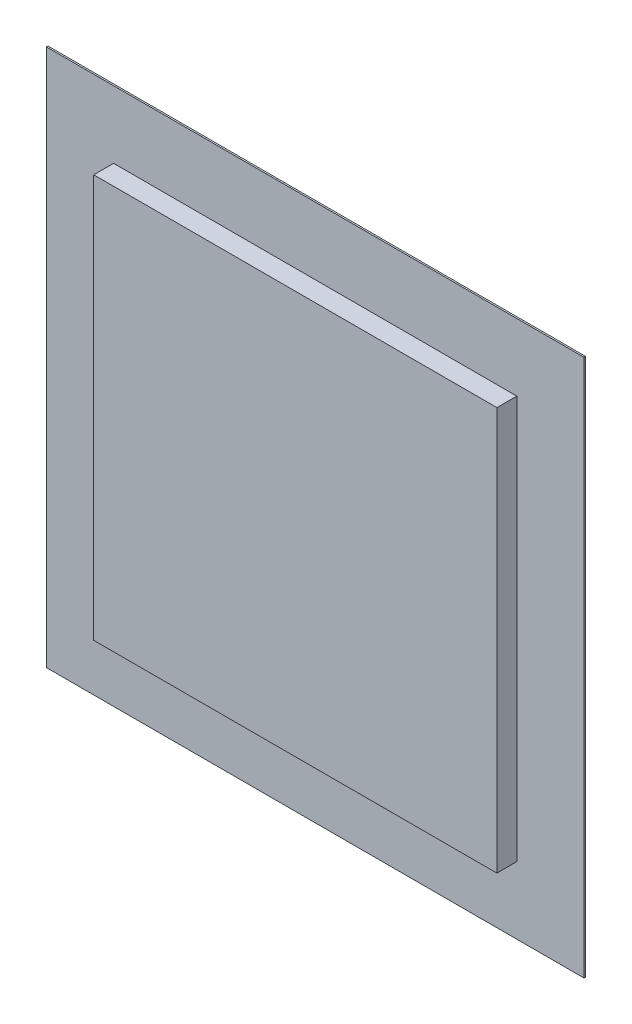
ISO-10303-21;
HEADER;
FILE_DESCRIPTION(('STEP AP214'),'2;1');
FILE_NAME('part.step','',(''),(''),'','','');
FILE_SCHEMA(('AUTOMOTIVE_DESIGN { 1 0 10303 214 1 1 1 1 }'));
ENDSEC;
DATA;
#1=APPLICATION_CONTEXT('core data for automotive mechanical design processes');
#2=APPLICATION_PROTOCOL_DEFINITION('international standard','automotive_design',2000,#1);
#3=PRODUCT_CONTEXT('',#1,'mechanical');
#4=PRODUCT('Part','Part','',(#3));
#5=PRODUCT_RELATED_PRODUCT_CATEGORY('part','',(#4));
#6=PRODUCT_DEFINITION_FORMATION('','',#4);
#7=PRODUCT_DEFINITION_CONTEXT('part definition',#1,'design');
#8=PRODUCT_DEFINITION('design','',#6,#7);
#9=PRODUCT_DEFINITION_SHAPE('','',#8);
#10=(LENGTH_UNIT() NAMED_UNIT(*) SI_UNIT(.MILLI.,.METRE.));
#11=(NAMED_UNIT(*) PLANE_ANGLE_UNIT() SI_UNIT($,.RADIAN.));
#12=(NAMED_UNIT(*) SI_UNIT($,.STERADIAN.) SOLID_ANGLE_UNIT());
#13=UNCERTAINTY_MEASURE_WITH_UNIT(LENGTH_MEASURE(1.E-05),#10,'distance_accuracy_value','');
#14=(GEOMETRIC_REPRESENTATION_CONTEXT(3) GLOBAL_UNCERTAINTY_ASSIGNED_CONTEXT((#13)) GLOBAL_UNIT_ASSIGNED_CONTEXT((#10,
#11,#12)) REPRESENTATION_CONTEXT('',''));
#15=CARTESIAN_POINT('',(0.,0.,0.));
#16=DIRECTION('',(0.,0.,1.));
#17=DIRECTION('',(1.,0.,0.));
#18=AXIS2_PLACEMENT_3D('',#15,#16,#17);
#19=CARTESIAN_POINT('',(0.,0.,0.3));
#20=DIRECTION('',(0.,0.,1.));
#21=DIRECTION('',(1.,0.,0.));
#22=AXIS2_PLACEMENT_3D('',#19,#20,#21);
#23=PLANE('',#22);
#24=DIRECTION('',(0.,-1.,0.));
#25=VECTOR('',#24,1.);
#26=CARTESIAN_POINT('',(-50.,50.,0.3));
#27=LINE('',#26,#25);
#28=CARTESIAN_POINT('',(-50.,50.,0.3));
#29=VERTEX_POINT('',#28);
#30=CARTESIAN_POINT('',(-50.,-50.,0.3));
#31=VERTEX_POINT('',#30);
#32=EDGE_CURVE('E147',#29,#31,#27,.T.);
#33=ORIENTED_EDGE('',*,*,#32,.T.);
#34=DIRECTION('',(1.,0.,0.));
#35=VECTOR('',#34,1.);
#36=CARTESIAN_POINT('',(-50.,-50.,0.3));
#37=LINE('',#36,#35);
#38=CARTESIAN_POINT('',(50.,-50.,0.3));
#39=VERTEX_POINT('',#38);
#40=EDGE_CURVE('E87',#31,#39,#37,.T.);
#41=ORIENTED_EDGE('',*,*,#40,.T.);
#42=DIRECTION('',(0.,1.,0.));
#43=VECTOR('',#42,1.);
#44=CARTESIAN_POINT('',(50.,-50.,0.3));
#45=LINE('',#44,#43);
#46=CARTESIAN_POINT('',(50.,50.,0.3));
#47=VERTEX_POINT('',#46);
#48=EDGE_CURVE('E150',#39,#47,#45,.T.);
#49=ORIENTED_EDGE('',*,*,#48,.T.);
#50=DIRECTION('',(-1.,0.,0.));
#51=VECTOR('',#50,1.);
#52=CARTESIAN_POINT('',(50.,50.,0.3));
#53=LINE('',#52,#51);
#54=EDGE_CURVE('E59',#47,#29,#53,.T.);
#55=ORIENTED_EDGE('',*,*,#54,.T.);
#56=EDGE_LOOP('',(#33,#41,#49,#55));
#57=FACE_BOUND('',#56,.T.);
#58=DIRECTION('',(-1.,0.,0.));
#59=VECTOR('',#58,1.);
#60=CARTESIAN_POINT('',(0.,-37.5,0.3));
#61=LINE('',#60,#59);
#62=CARTESIAN_POINT('',(37.5,-37.5,0.3));
#63=VERTEX_POINT('',#62);
#64=CARTESIAN_POINT('',(-37.5,-37.5,0.3));
#65=VERTEX_POINT('',#64);
#66=EDGE_CURVE('E143',#63,#65,#61,.T.);
#67=ORIENTED_EDGE('',*,*,#66,.T.);
#68=DIRECTION('',(0.,1.,0.));
#69=VECTOR('',#68,1.);
#70=CARTESIAN_POINT('',(-37.5,0.,0.3));
#71=LINE('',#70,#69);
#72=CARTESIAN_POINT('',(-37.5,37.5,0.3));
#73=VERTEX_POINT('',#72);
#74=EDGE_CURVE('E132',#65,#73,#71,.T.);
#75=ORIENTED_EDGE('',*,*,#74,.T.);
#76=DIRECTION('',(1.,0.,0.));
#77=VECTOR('',#76,1.);
#78=CARTESIAN_POINT('',(0.,37.5,0.3));
#79=LINE('',#78,#77);
#80=CARTESIAN_POINT('',(37.5,37.5,0.3));
#81=VERTEX_POINT('',#80);
#82=EDGE_CURVE('E133',#73,#81,#79,.T.);
#83=ORIENTED_EDGE('',*,*,#82,.T.);
#84=DIRECTION('',(0.,-1.,0.));
#85=VECTOR('',#84,1.);
#86=CARTESIAN_POINT('',(37.5,0.,0.3));
#87=LINE('',#86,#85);
#88=EDGE_CURVE('E136',#81,#63,#87,.T.);
#89=ORIENTED_EDGE('',*,*,#88,.T.);
#90=EDGE_LOOP('',(#67,#75,#83,#89));
#91=FACE_BOUND('',#90,.T.);
#92=ADVANCED_FACE('F35',(#57,#91),#23,.T.);
#93=CARTESIAN_POINT('',(-50.,50.,0.3));
#94=DIRECTION('',(1.,0.,0.));
#95=DIRECTION('',(0.,0.,-1.));
#96=AXIS2_PLACEMENT_3D('',#93,#94,#95);
#97=PLANE('',#96);
#98=DIRECTION('',(0.,-1.,0.));
#99=VECTOR('',#98,1.);
#100=CARTESIAN_POINT('',(-50.,50.,0.));
#101=LINE('',#100,#99);
#102=CARTESIAN_POINT('',(-50.,50.,0.));
#103=VERTEX_POINT('',#102);
#104=CARTESIAN_POINT('',(-50.,-50.,0.));
#105=VERTEX_POINT('',#104);
#106=EDGE_CURVE('E146',#103,#105,#101,.T.);
#107=ORIENTED_EDGE('',*,*,#106,.T.);
#108=DIRECTION('',(0.,0.,-1.));
#109=VECTOR('',#108,1.);
#110=CARTESIAN_POINT('',(-50.,-50.,0.3));
#111=LINE('',#110,#109);
#112=EDGE_CURVE('E11',#31,#105,#111,.T.);
#113=ORIENTED_EDGE('',*,*,#112,.F.);
#114=ORIENTED_EDGE('',*,*,#32,.F.);
#115=DIRECTION('',(0.,0.,-1.));
#116=VECTOR('',#115,1.);
#117=CARTESIAN_POINT('',(-50.,50.,0.3));
#118=LINE('',#117,#116);
#119=EDGE_CURVE('E153',#29,#103,#118,.T.);
#120=ORIENTED_EDGE('',*,*,#119,.T.);
#121=EDGE_LOOP('',(#107,#113,#114,#120));
#122=FACE_BOUND('',#121,.T.);
#123=ADVANCED_FACE('F37',(#122),#97,.F.);
#124=CARTESIAN_POINT('',(-50.,-50.,0.3));
#125=DIRECTION('',(0.,1.,0.));
#126=DIRECTION('',(0.,0.,1.));
#127=AXIS2_PLACEMENT_3D('',#124,#125,#126);
#128=PLANE('',#127);
#129=DIRECTION('',(1.,0.,0.));
#130=VECTOR('',#129,1.);
#131=CARTESIAN_POINT('',(-50.,-50.,0.));
#132=LINE('',#131,#130);
#133=CARTESIAN_POINT('',(50.,-50.,0.));
#134=VERTEX_POINT('',#133);
#135=EDGE_CURVE('E156',#105,#134,#132,.T.);
#136=ORIENTED_EDGE('',*,*,#135,.T.);
#137=DIRECTION('',(0.,0.,-1.));
#138=VECTOR('',#137,1.);
#139=CARTESIAN_POINT('',(50.,-50.,0.3));
#140=LINE('',#139,#138);
#141=EDGE_CURVE('E43',#39,#134,#140,.T.);
#142=ORIENTED_EDGE('',*,*,#141,.F.);
#143=ORIENTED_EDGE('',*,*,#40,.F.);
#144=ORIENTED_EDGE('',*,*,#112,.T.);
#145=EDGE_LOOP('',(#136,#142,#143,#144));
#146=FACE_BOUND('',#145,.T.);
#147=ADVANCED_FACE('F183',(#146),#128,.F.);
#148=CARTESIAN_POINT('',(50.,-50.,0.3));
#149=DIRECTION('',(-1.,0.,0.));
#150=DIRECTION('',(0.,0.,1.));
#151=AXIS2_PLACEMENT_3D('',#148,#149,#150);
#152=PLANE('',#151);
#153=DIRECTION('',(0.,1.,0.));
#154=VECTOR('',#153,1.);
#155=CARTESIAN_POINT('',(50.,-50.,0.));
#156=LINE('',#155,#154);
#157=CARTESIAN_POINT('',(50.,50.,0.));
#158=VERTEX_POINT('',#157);
#159=EDGE_CURVE('E158',#134,#158,#156,.T.);
#160=ORIENTED_EDGE('',*,*,#159,.T.);
#161=DIRECTION('',(0.,0.,-1.));
#162=VECTOR('',#161,1.);
#163=CARTESIAN_POINT('',(50.,50.,0.3));
#164=LINE('',#163,#162);
#165=EDGE_CURVE('E162',#47,#158,#164,.T.);
#166=ORIENTED_EDGE('',*,*,#165,.F.);
#167=ORIENTED_EDGE('',*,*,#48,.F.);
#168=ORIENTED_EDGE('',*,*,#141,.T.);
#169=EDGE_LOOP('',(#160,#166,#167,#168));
#170=FACE_BOUND('',#169,.T.);
#171=ADVANCED_FACE('F167',(#170),#152,.F.);
#172=CARTESIAN_POINT('',(50.,50.,0.3));
#173=DIRECTION('',(0.,-1.,0.));
#174=DIRECTION('',(0.,0.,-1.));
#175=AXIS2_PLACEMENT_3D('',#172,#173,#174);
#176=PLANE('',#175);
#177=DIRECTION('',(-1.,0.,0.));
#178=VECTOR('',#177,1.);
#179=CARTESIAN_POINT('',(50.,50.,0.));
#180=LINE('',#179,#178);
#181=EDGE_CURVE('E80',#158,#103,#180,.T.);
#182=ORIENTED_EDGE('',*,*,#181,.T.);
#183=ORIENTED_EDGE('',*,*,#119,.F.);
#184=ORIENTED_EDGE('',*,*,#54,.F.);
#185=ORIENTED_EDGE('',*,*,#165,.T.);
#186=EDGE_LOOP('',(#182,#183,#184,#185));
#187=FACE_BOUND('',#186,.T.);
#188=ADVANCED_FACE('F175',(#187),#176,.F.);
#189=CARTESIAN_POINT('',(0.,0.,0.));
#190=DIRECTION('',(0.,0.,1.));
#191=DIRECTION('',(1.,0.,0.));
#192=AXIS2_PLACEMENT_3D('',#189,#190,#191);
#193=PLANE('',#192);
#194=ORIENTED_EDGE('',*,*,#106,.F.);
#195=ORIENTED_EDGE('',*,*,#181,.F.);
#196=ORIENTED_EDGE('',*,*,#159,.F.);
#197=ORIENTED_EDGE('',*,*,#135,.F.);
#198=EDGE_LOOP('',(#194,#195,#196,#197));
#199=FACE_BOUND('',#198,.T.);
#200=ADVANCED_FACE('F171',(#199),#193,.F.);
#201=CARTESIAN_POINT('',(-37.5,37.5,4.));
#202=DIRECTION('',(1.,0.,0.));
#203=DIRECTION('',(0.,0.,-1.));
#204=AXIS2_PLACEMENT_3D('',#201,#202,#203);
#205=PLANE('',#204);
#206=ORIENTED_EDGE('',*,*,#74,.F.);
#207=DIRECTION('',(0.,0.,-1.));
#208=VECTOR('',#207,1.);
#209=CARTESIAN_POINT('',(-37.5,-37.5,4.));
#210=LINE('',#209,#208);
#211=CARTESIAN_POINT('',(-37.5,-37.5,4.));
#212=VERTEX_POINT('',#211);
#213=EDGE_CURVE('E114',#212,#65,#210,.T.);
#214=ORIENTED_EDGE('',*,*,#213,.F.);
#215=DIRECTION('',(0.,-1.,0.));
#216=VECTOR('',#215,1.);
#217=CARTESIAN_POINT('',(-37.5,37.5,4.));
#218=LINE('',#217,#216);
#219=CARTESIAN_POINT('',(-37.5,37.5,4.));
#220=VERTEX_POINT('',#219);
#221=EDGE_CURVE('E121',#220,#212,#218,.T.);
#222=ORIENTED_EDGE('',*,*,#221,.F.);
#223=DIRECTION('',(0.,0.,-1.));
#224=VECTOR('',#223,1.);
#225=CARTESIAN_POINT('',(-37.5,37.5,4.));
#226=LINE('',#225,#224);
#227=EDGE_CURVE('E267',#220,#73,#226,.T.);
#228=ORIENTED_EDGE('',*,*,#227,.T.);
#229=EDGE_LOOP('',(#206,#214,#222,#228));
#230=FACE_BOUND('',#229,.T.);
#231=ADVANCED_FACE('F130',(#230),#205,.F.);
#232=CARTESIAN_POINT('',(-37.5,-37.5,4.));
#233=DIRECTION('',(0.,1.,0.));
#234=DIRECTION('',(0.,0.,1.));
#235=AXIS2_PLACEMENT_3D('',#232,#233,#234);
#236=PLANE('',#235);
#237=ORIENTED_EDGE('',*,*,#66,.F.);
#238=DIRECTION('',(0.,0.,-1.));
#239=VECTOR('',#238,1.);
#240=CARTESIAN_POINT('',(37.5,-37.5,4.));
#241=LINE('',#240,#239);
#242=CARTESIAN_POINT('',(37.5,-37.5,4.));
#243=VERTEX_POINT('',#242);
#244=EDGE_CURVE('E117',#243,#63,#241,.T.);
#245=ORIENTED_EDGE('',*,*,#244,.F.);
#246=DIRECTION('',(1.,0.,0.));
#247=VECTOR('',#246,1.);
#248=CARTESIAN_POINT('',(-37.5,-37.5,4.));
#249=LINE('',#248,#247);
#250=EDGE_CURVE('E110',#212,#243,#249,.T.);
#251=ORIENTED_EDGE('',*,*,#250,.F.);
#252=ORIENTED_EDGE('',*,*,#213,.T.);
#253=EDGE_LOOP('',(#237,#245,#251,#252));
#254=FACE_BOUND('',#253,.T.);
#255=ADVANCED_FACE('F112',(#254),#236,.F.);
#256=CARTESIAN_POINT('',(37.5,-37.5,4.));
#257=DIRECTION('',(-1.,0.,0.));
#258=DIRECTION('',(0.,0.,1.));
#259=AXIS2_PLACEMENT_3D('',#256,#257,#258);
#260=PLANE('',#259);
#261=ORIENTED_EDGE('',*,*,#88,.F.);
#262=DIRECTION('',(0.,0.,-1.));
#263=VECTOR('',#262,1.);
#264=CARTESIAN_POINT('',(37.5,37.5,4.));
#265=LINE('',#264,#263);
#266=CARTESIAN_POINT('',(37.5,37.5,4.));
#267=VERTEX_POINT('',#266);
#268=EDGE_CURVE('E50',#267,#81,#265,.T.);
#269=ORIENTED_EDGE('',*,*,#268,.F.);
#270=DIRECTION('',(0.,1.,0.));
#271=VECTOR('',#270,1.);
#272=CARTESIAN_POINT('',(37.5,-37.5,4.));
#273=LINE('',#272,#271);
#274=EDGE_CURVE('E120',#243,#267,#273,.T.);
#275=ORIENTED_EDGE('',*,*,#274,.F.);
#276=ORIENTED_EDGE('',*,*,#244,.T.);
#277=EDGE_LOOP('',(#261,#269,#275,#276));
#278=FACE_BOUND('',#277,.T.);
#279=ADVANCED_FACE('F196',(#278),#260,.F.);
#280=CARTESIAN_POINT('',(37.5,37.5,4.));
#281=DIRECTION('',(0.,-1.,0.));
#282=DIRECTION('',(0.,0.,-1.));
#283=AXIS2_PLACEMENT_3D('',#280,#281,#282);
#284=PLANE('',#283);
#285=ORIENTED_EDGE('',*,*,#82,.F.);
#286=ORIENTED_EDGE('',*,*,#227,.F.);
#287=DIRECTION('',(-1.,0.,0.));
#288=VECTOR('',#287,1.);
#289=CARTESIAN_POINT('',(37.5,37.5,4.));
#290=LINE('',#289,#288);
#291=EDGE_CURVE('E125',#267,#220,#290,.T.);
#292=ORIENTED_EDGE('',*,*,#291,.F.);
#293=ORIENTED_EDGE('',*,*,#268,.T.);
#294=EDGE_LOOP('',(#285,#286,#292,#293));
#295=FACE_BOUND('',#294,.T.);
#296=ADVANCED_FACE('F199',(#295),#284,.F.);
#297=CARTESIAN_POINT('',(0.,0.,4.));
#298=DIRECTION('',(0.,0.,1.));
#299=DIRECTION('',(1.,0.,0.));
#300=AXIS2_PLACEMENT_3D('',#297,#298,#299);
#301=PLANE('',#300);
#302=ORIENTED_EDGE('',*,*,#221,.T.);
#303=ORIENTED_EDGE('',*,*,#250,.T.);
#304=ORIENTED_EDGE('',*,*,#274,.T.);
#305=ORIENTED_EDGE('',*,*,#291,.T.);
#306=EDGE_LOOP('',(#302,#303,#304,#305));
#307=FACE_BOUND('',#306,.T.);
#308=ADVANCED_FACE('F124',(#307),#301,.T.);
#309=CLOSED_SHELL('',(#92,#123,#147,#171,#188,#200,#231,#255,#279,#296,#308));
#310=MANIFOLD_SOLID_BREP('B2',#309);
#311=ADVANCED_BREP_SHAPE_REPRESENTATION('',(#18,#310),#14);
#312=SHAPE_DEFINITION_REPRESENTATION(#9,#311);
ENDSEC;
END-ISO-10303-21;
